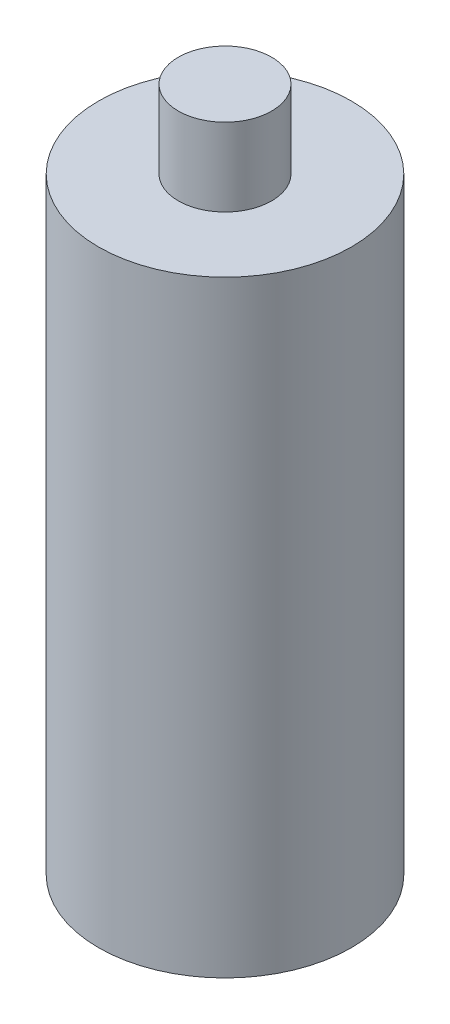
ISO-10303-21;
HEADER;
FILE_DESCRIPTION(('STEP AP214'),'2;1');
FILE_NAME('part.step','',(''),(''),'','','');
FILE_SCHEMA(('AUTOMOTIVE_DESIGN { 1 0 10303 214 1 1 1 1 }'));
ENDSEC;
DATA;
#1=APPLICATION_CONTEXT('core data for automotive mechanical design processes');
#2=APPLICATION_PROTOCOL_DEFINITION('international standard','automotive_design',2000,#1);
#3=PRODUCT_CONTEXT('',#1,'mechanical');
#4=PRODUCT('Part','Part','',(#3));
#5=PRODUCT_RELATED_PRODUCT_CATEGORY('part','',(#4));
#6=PRODUCT_DEFINITION_FORMATION('','',#4);
#7=PRODUCT_DEFINITION_CONTEXT('part definition',#1,'design');
#8=PRODUCT_DEFINITION('design','',#6,#7);
#9=PRODUCT_DEFINITION_SHAPE('','',#8);
#10=(LENGTH_UNIT() NAMED_UNIT(*) SI_UNIT(.MILLI.,.METRE.));
#11=(NAMED_UNIT(*) PLANE_ANGLE_UNIT() SI_UNIT($,.RADIAN.));
#12=(NAMED_UNIT(*) SI_UNIT($,.STERADIAN.) SOLID_ANGLE_UNIT());
#13=UNCERTAINTY_MEASURE_WITH_UNIT(LENGTH_MEASURE(1.E-05),#10,'distance_accuracy_value','');
#14=(GEOMETRIC_REPRESENTATION_CONTEXT(3) GLOBAL_UNCERTAINTY_ASSIGNED_CONTEXT((#13)) GLOBAL_UNIT_ASSIGNED_CONTEXT((#10,
#11,#12)) REPRESENTATION_CONTEXT('',''));
#15=CARTESIAN_POINT('',(0.,0.,0.));
#16=DIRECTION('',(0.,0.,1.));
#17=DIRECTION('',(1.,0.,0.));
#18=AXIS2_PLACEMENT_3D('',#15,#16,#17);
#19=CARTESIAN_POINT('',(0.,15.6,0.));
#20=DIRECTION('',(0.,-1.,0.));
#21=DIRECTION('',(0.,0.,-1.));
#22=AXIS2_PLACEMENT_3D('',#19,#20,#21);
#23=CYLINDRICAL_SURFACE('',#22,3.25);
#24=CARTESIAN_POINT('',(0.,15.6,0.));
#25=DIRECTION('',(0.,1.,0.));
#26=DIRECTION('',(0.,0.,1.));
#27=AXIS2_PLACEMENT_3D('',#24,#25,#26);
#28=CIRCLE('',#27,3.25);
#29=CARTESIAN_POINT('',(0.,15.6,3.25));
#30=VERTEX_POINT('',#29);
#31=EDGE_CURVE('E49',#30,#30,#28,.T.);
#32=ORIENTED_EDGE('',*,*,#31,.F.);
#33=EDGE_LOOP('',(#32));
#34=FACE_BOUND('',#33,.T.);
#35=CARTESIAN_POINT('',(0.,0.,0.));
#36=DIRECTION('',(0.,1.,0.));
#37=DIRECTION('',(0.,0.,1.));
#38=AXIS2_PLACEMENT_3D('',#35,#36,#37);
#39=CIRCLE('',#38,3.25);
#40=CARTESIAN_POINT('',(0.,0.,3.25));
#41=VERTEX_POINT('',#40);
#42=EDGE_CURVE('E44',#41,#41,#39,.T.);
#43=ORIENTED_EDGE('',*,*,#42,.T.);
#44=EDGE_LOOP('',(#43));
#45=FACE_BOUND('',#44,.T.);
#46=ADVANCED_FACE('F41',(#34,#45),#23,.T.);
#47=CARTESIAN_POINT('',(0.,15.6,0.));
#48=DIRECTION('',(0.,1.,0.));
#49=DIRECTION('',(0.,0.,1.));
#50=AXIS2_PLACEMENT_3D('',#47,#48,#49);
#51=PLANE('',#50);
#52=CARTESIAN_POINT('',(0.,15.6,0.));
#53=DIRECTION('',(0.,1.,0.));
#54=DIRECTION('',(0.,0.,1.));
#55=AXIS2_PLACEMENT_3D('',#52,#53,#54);
#56=CIRCLE('',#55,1.2);
#57=CARTESIAN_POINT('',(0.,15.6,1.2));
#58=VERTEX_POINT('',#57);
#59=EDGE_CURVE('E10',#58,#58,#56,.T.);
#60=ORIENTED_EDGE('',*,*,#59,.F.);
#61=EDGE_LOOP('',(#60));
#62=FACE_BOUND('',#61,.T.);
#63=ORIENTED_EDGE('',*,*,#31,.T.);
#64=EDGE_LOOP('',(#63));
#65=FACE_BOUND('',#64,.T.);
#66=ADVANCED_FACE('F69',(#62,#65),#51,.T.);
#67=CARTESIAN_POINT('',(0.,0.,0.));
#68=DIRECTION('',(0.,1.,0.));
#69=DIRECTION('',(0.,0.,1.));
#70=AXIS2_PLACEMENT_3D('',#67,#68,#69);
#71=PLANE('',#70);
#72=ORIENTED_EDGE('',*,*,#42,.F.);
#73=EDGE_LOOP('',(#72));
#74=FACE_BOUND('',#73,.T.);
#75=ADVANCED_FACE('F66',(#74),#71,.F.);
#76=CARTESIAN_POINT('',(0.,17.6,0.));
#77=DIRECTION('',(0.,-1.,0.));
#78=DIRECTION('',(0.,0.,-1.));
#79=AXIS2_PLACEMENT_3D('',#76,#77,#78);
#80=CYLINDRICAL_SURFACE('',#79,1.2);
#81=CARTESIAN_POINT('',(0.,17.6,0.));
#82=DIRECTION('',(0.,1.,0.));
#83=DIRECTION('',(0.,0.,1.));
#84=AXIS2_PLACEMENT_3D('',#81,#82,#83);
#85=CIRCLE('',#84,1.2);
#86=CARTESIAN_POINT('',(0.,17.6,1.2));
#87=VERTEX_POINT('',#86);
#88=EDGE_CURVE('E56',#87,#87,#85,.T.);
#89=ORIENTED_EDGE('',*,*,#88,.F.);
#90=EDGE_LOOP('',(#89));
#91=FACE_BOUND('',#90,.T.);
#92=ORIENTED_EDGE('',*,*,#59,.T.);
#93=EDGE_LOOP('',(#92));
#94=FACE_BOUND('',#93,.T.);
#95=ADVANCED_FACE('F68',(#91,#94),#80,.T.);
#96=CARTESIAN_POINT('',(0.,17.6,0.));
#97=DIRECTION('',(0.,1.,0.));
#98=DIRECTION('',(0.,0.,1.));
#99=AXIS2_PLACEMENT_3D('',#96,#97,#98);
#100=PLANE('',#99);
#101=ORIENTED_EDGE('',*,*,#88,.T.);
#102=EDGE_LOOP('',(#101));
#103=FACE_BOUND('',#102,.T.);
#104=ADVANCED_FACE('F74',(#103),#100,.T.);
#105=CLOSED_SHELL('',(#46,#66,#75,#95,#104));
#106=MANIFOLD_SOLID_BREP('B2',#105);
#107=ADVANCED_BREP_SHAPE_REPRESENTATION('',(#18,#106),#14);
#108=SHAPE_DEFINITION_REPRESENTATION(#9,#107);
ENDSEC;
END-ISO-10303-21;
